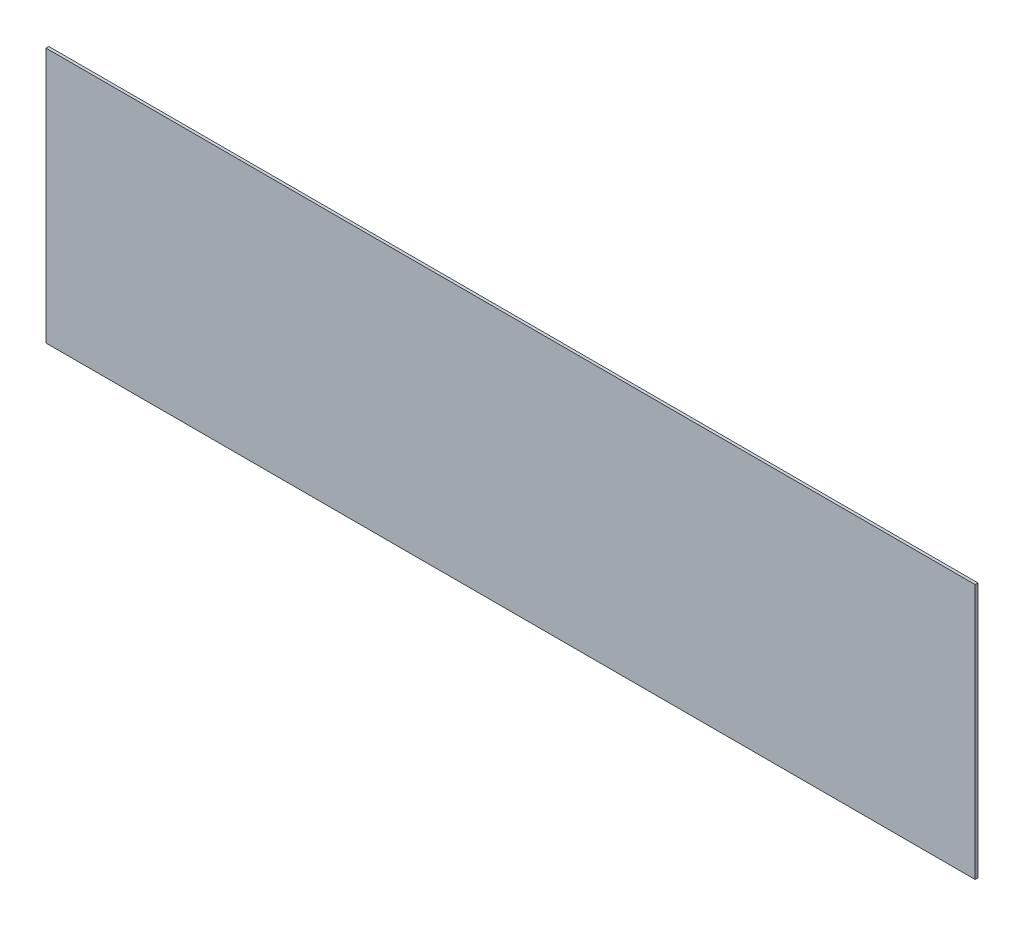
ISO-10303-21;
HEADER;
FILE_DESCRIPTION(('STEP AP214'),'2;1');
FILE_NAME('part.step','',(''),(''),'','','');
FILE_SCHEMA(('AUTOMOTIVE_DESIGN { 1 0 10303 214 1 1 1 1 }'));
ENDSEC;
DATA;
#1=APPLICATION_CONTEXT('core data for automotive mechanical design processes');
#2=APPLICATION_PROTOCOL_DEFINITION('international standard','automotive_design',2000,#1);
#3=PRODUCT_CONTEXT('',#1,'mechanical');
#4=PRODUCT('Part','Part','',(#3));
#5=PRODUCT_RELATED_PRODUCT_CATEGORY('part','',(#4));
#6=PRODUCT_DEFINITION_FORMATION('','',#4);
#7=PRODUCT_DEFINITION_CONTEXT('part definition',#1,'design');
#8=PRODUCT_DEFINITION('design','',#6,#7);
#9=PRODUCT_DEFINITION_SHAPE('','',#8);
#10=(LENGTH_UNIT() NAMED_UNIT(*) SI_UNIT(.MILLI.,.METRE.));
#11=(NAMED_UNIT(*) PLANE_ANGLE_UNIT() SI_UNIT($,.RADIAN.));
#12=(NAMED_UNIT(*) SI_UNIT($,.STERADIAN.) SOLID_ANGLE_UNIT());
#13=UNCERTAINTY_MEASURE_WITH_UNIT(LENGTH_MEASURE(1.E-05),#10,'distance_accuracy_value','');
#14=(GEOMETRIC_REPRESENTATION_CONTEXT(3) GLOBAL_UNCERTAINTY_ASSIGNED_CONTEXT((#13)) GLOBAL_UNIT_ASSIGNED_CONTEXT((#10,
#11,#12)) REPRESENTATION_CONTEXT('',''));
#15=CARTESIAN_POINT('',(0.,0.,0.));
#16=DIRECTION('',(0.,0.,1.));
#17=DIRECTION('',(1.,0.,0.));
#18=AXIS2_PLACEMENT_3D('',#15,#16,#17);
#19=CARTESIAN_POINT('',(-113.503324334308,11.5655948278874,0.5));
#20=DIRECTION('',(1.,0.,0.));
#21=DIRECTION('',(0.,0.,-1.));
#22=AXIS2_PLACEMENT_3D('',#19,#20,#21);
#23=PLANE('',#22);
#24=DIRECTION('',(0.,-1.,0.));
#25=VECTOR('',#24,1.);
#26=CARTESIAN_POINT('',(-113.503324334308,11.5655948278874,0.));
#27=LINE('',#26,#25);
#28=CARTESIAN_POINT('',(-113.503324334308,11.5655948278874,0.));
#29=VERTEX_POINT('',#28);
#30=CARTESIAN_POINT('',(-113.503324334308,-33.9344051721126,0.));
#31=VERTEX_POINT('',#30);
#32=EDGE_CURVE('E95',#29,#31,#27,.T.);
#33=ORIENTED_EDGE('',*,*,#32,.T.);
#34=DIRECTION('',(0.,0.,-1.));
#35=VECTOR('',#34,1.);
#36=CARTESIAN_POINT('',(-113.503324334308,-33.9344051721126,0.5));
#37=LINE('',#36,#35);
#38=CARTESIAN_POINT('',(-113.503324334308,-33.9344051721126,0.5));
#39=VERTEX_POINT('',#38);
#40=EDGE_CURVE('E11',#39,#31,#37,.T.);
#41=ORIENTED_EDGE('',*,*,#40,.F.);
#42=DIRECTION('',(0.,-1.,0.));
#43=VECTOR('',#42,1.);
#44=CARTESIAN_POINT('',(-113.503324334308,11.5655948278874,0.5));
#45=LINE('',#44,#43);
#46=CARTESIAN_POINT('',(-113.503324334308,11.5655948278874,0.5));
#47=VERTEX_POINT('',#46);
#48=EDGE_CURVE('E83',#47,#39,#45,.T.);
#49=ORIENTED_EDGE('',*,*,#48,.F.);
#50=DIRECTION('',(0.,0.,-1.));
#51=VECTOR('',#50,1.);
#52=CARTESIAN_POINT('',(-113.503324334308,11.5655948278874,0.5));
#53=LINE('',#52,#51);
#54=EDGE_CURVE('E91',#47,#29,#53,.T.);
#55=ORIENTED_EDGE('',*,*,#54,.T.);
#56=EDGE_LOOP('',(#33,#41,#49,#55));
#57=FACE_BOUND('',#56,.T.);
#58=ADVANCED_FACE('F32',(#57),#23,.F.);
#59=CARTESIAN_POINT('',(-113.503324334308,-33.9344051721126,0.5));
#60=DIRECTION('',(0.,1.,0.));
#61=DIRECTION('',(0.,0.,1.));
#62=AXIS2_PLACEMENT_3D('',#59,#60,#61);
#63=PLANE('',#62);
#64=DIRECTION('',(1.,0.,0.));
#65=VECTOR('',#64,1.);
#66=CARTESIAN_POINT('',(-113.503324334308,-33.9344051721126,0.));
#67=LINE('',#66,#65);
#68=CARTESIAN_POINT('',(51.9966756656919,-33.9344051721126,0.));
#69=VERTEX_POINT('',#68);
#70=EDGE_CURVE('E87',#31,#69,#67,.T.);
#71=ORIENTED_EDGE('',*,*,#70,.T.);
#72=DIRECTION('',(0.,0.,-1.));
#73=VECTOR('',#72,1.);
#74=CARTESIAN_POINT('',(51.9966756656919,-33.9344051721126,0.5));
#75=LINE('',#74,#73);
#76=CARTESIAN_POINT('',(51.9966756656919,-33.9344051721126,0.5));
#77=VERTEX_POINT('',#76);
#78=EDGE_CURVE('E40',#77,#69,#75,.T.);
#79=ORIENTED_EDGE('',*,*,#78,.F.);
#80=DIRECTION('',(1.,0.,0.));
#81=VECTOR('',#80,1.);
#82=CARTESIAN_POINT('',(-113.503324334308,-33.9344051721126,0.5));
#83=LINE('',#82,#81);
#84=EDGE_CURVE('E78',#39,#77,#83,.T.);
#85=ORIENTED_EDGE('',*,*,#84,.F.);
#86=ORIENTED_EDGE('',*,*,#40,.T.);
#87=EDGE_LOOP('',(#71,#79,#85,#86));
#88=FACE_BOUND('',#87,.T.);
#89=ADVANCED_FACE('F86',(#88),#63,.F.);
#90=CARTESIAN_POINT('',(51.9966756656919,11.5655948278874,0.5));
#91=DIRECTION('',(-1.,0.,0.));
#92=DIRECTION('',(0.,0.,1.));
#93=AXIS2_PLACEMENT_3D('',#90,#91,#92);
#94=PLANE('',#93);
#95=DIRECTION('',(0.,1.,0.));
#96=VECTOR('',#95,1.);
#97=CARTESIAN_POINT('',(51.9966756656919,11.5655948278874,0.));
#98=LINE('',#97,#96);
#99=CARTESIAN_POINT('',(51.9966756656919,11.5655948278874,0.));
#100=VERTEX_POINT('',#99);
#101=EDGE_CURVE('E65',#69,#100,#98,.T.);
#102=ORIENTED_EDGE('',*,*,#101,.T.);
#103=DIRECTION('',(0.,0.,-1.));
#104=VECTOR('',#103,1.);
#105=CARTESIAN_POINT('',(51.9966756656919,11.5655948278874,0.5));
#106=LINE('',#105,#104);
#107=CARTESIAN_POINT('',(51.9966756656919,11.5655948278874,0.5));
#108=VERTEX_POINT('',#107);
#109=EDGE_CURVE('E88',#108,#100,#106,.T.);
#110=ORIENTED_EDGE('',*,*,#109,.F.);
#111=DIRECTION('',(0.,1.,0.));
#112=VECTOR('',#111,1.);
#113=CARTESIAN_POINT('',(51.9966756656919,11.5655948278874,0.5));
#114=LINE('',#113,#112);
#115=EDGE_CURVE('E81',#77,#108,#114,.T.);
#116=ORIENTED_EDGE('',*,*,#115,.F.);
#117=ORIENTED_EDGE('',*,*,#78,.T.);
#118=EDGE_LOOP('',(#102,#110,#116,#117));
#119=FACE_BOUND('',#118,.T.);
#120=ADVANCED_FACE('F89',(#119),#94,.F.);
#121=CARTESIAN_POINT('',(-113.503324334308,11.5655948278874,0.5));
#122=DIRECTION('',(0.,-1.,0.));
#123=DIRECTION('',(0.,0.,-1.));
#124=AXIS2_PLACEMENT_3D('',#121,#122,#123);
#125=PLANE('',#124);
#126=DIRECTION('',(-1.,0.,0.));
#127=VECTOR('',#126,1.);
#128=CARTESIAN_POINT('',(-113.503324334308,11.5655948278874,0.));
#129=LINE('',#128,#127);
#130=EDGE_CURVE('E71',#100,#29,#129,.T.);
#131=ORIENTED_EDGE('',*,*,#130,.T.);
#132=ORIENTED_EDGE('',*,*,#54,.F.);
#133=DIRECTION('',(-1.,0.,0.));
#134=VECTOR('',#133,1.);
#135=CARTESIAN_POINT('',(-113.503324334308,11.5655948278874,0.5));
#136=LINE('',#135,#134);
#137=EDGE_CURVE('E48',#108,#47,#136,.T.);
#138=ORIENTED_EDGE('',*,*,#137,.F.);
#139=ORIENTED_EDGE('',*,*,#109,.T.);
#140=EDGE_LOOP('',(#131,#132,#138,#139));
#141=FACE_BOUND('',#140,.T.);
#142=ADVANCED_FACE('F102',(#141),#125,.F.);
#143=CARTESIAN_POINT('',(0.,0.,0.5));
#144=DIRECTION('',(0.,0.,1.));
#145=DIRECTION('',(1.,0.,0.));
#146=AXIS2_PLACEMENT_3D('',#143,#144,#145);
#147=PLANE('',#146);
#148=ORIENTED_EDGE('',*,*,#48,.T.);
#149=ORIENTED_EDGE('',*,*,#84,.T.);
#150=ORIENTED_EDGE('',*,*,#115,.T.);
#151=ORIENTED_EDGE('',*,*,#137,.T.);
#152=EDGE_LOOP('',(#148,#149,#150,#151));
#153=FACE_BOUND('',#152,.T.);
#154=ADVANCED_FACE('F79',(#153),#147,.T.);
#155=CARTESIAN_POINT('',(0.,0.,0.));
#156=DIRECTION('',(0.,0.,1.));
#157=DIRECTION('',(1.,0.,0.));
#158=AXIS2_PLACEMENT_3D('',#155,#156,#157);
#159=PLANE('',#158);
#160=ORIENTED_EDGE('',*,*,#32,.F.);
#161=ORIENTED_EDGE('',*,*,#130,.F.);
#162=ORIENTED_EDGE('',*,*,#101,.F.);
#163=ORIENTED_EDGE('',*,*,#70,.F.);
#164=EDGE_LOOP('',(#160,#161,#162,#163));
#165=FACE_BOUND('',#164,.T.);
#166=ADVANCED_FACE('F105',(#165),#159,.F.);
#167=CLOSED_SHELL('',(#58,#89,#120,#142,#154,#166));
#168=MANIFOLD_SOLID_BREP('B2',#167);
#169=ADVANCED_BREP_SHAPE_REPRESENTATION('',(#18,#168),#14);
#170=SHAPE_DEFINITION_REPRESENTATION(#9,#169);
ENDSEC;
END-ISO-10303-21;
